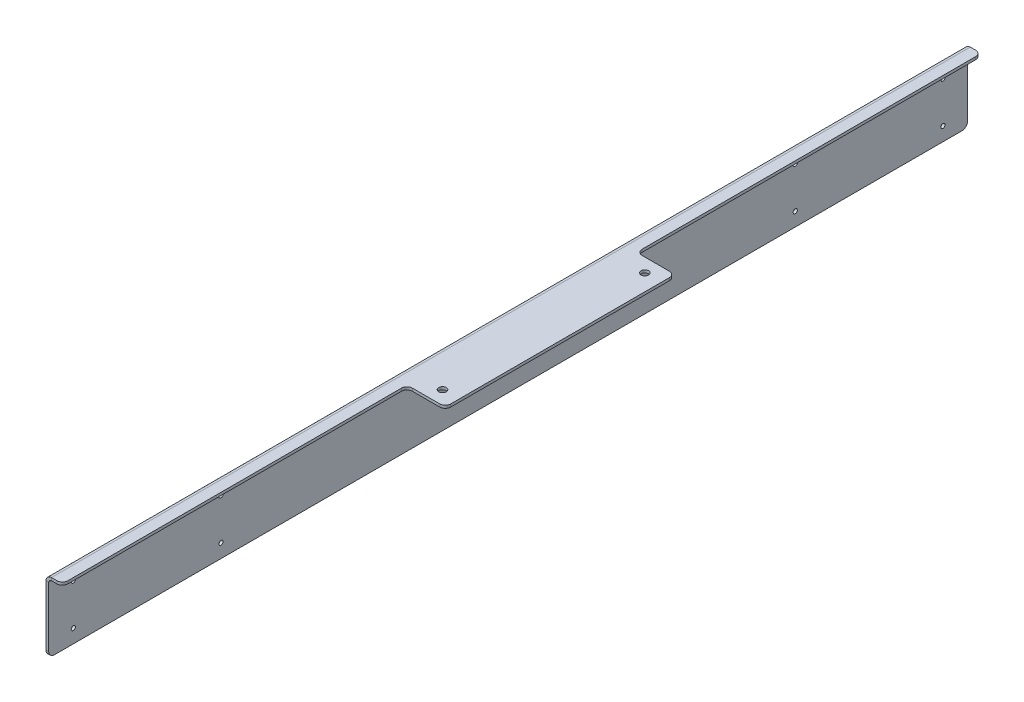
ISO-10303-21;
HEADER;
FILE_DESCRIPTION(('STEP AP214'),'2;1');
FILE_NAME('part.step','',(''),(''),'','','');
FILE_SCHEMA(('AUTOMOTIVE_DESIGN { 1 0 10303 214 1 1 1 1 }'));
ENDSEC;
DATA;
#1=APPLICATION_CONTEXT('core data for automotive mechanical design processes');
#2=APPLICATION_PROTOCOL_DEFINITION('international standard','automotive_design',2000,#1);
#3=PRODUCT_CONTEXT('',#1,'mechanical');
#4=PRODUCT('Part','Part','',(#3));
#5=PRODUCT_RELATED_PRODUCT_CATEGORY('part','',(#4));
#6=PRODUCT_DEFINITION_FORMATION('','',#4);
#7=PRODUCT_DEFINITION_CONTEXT('part definition',#1,'design');
#8=PRODUCT_DEFINITION('design','',#6,#7);
#9=PRODUCT_DEFINITION_SHAPE('','',#8);
#10=(LENGTH_UNIT() NAMED_UNIT(*) SI_UNIT(.MILLI.,.METRE.));
#11=(NAMED_UNIT(*) PLANE_ANGLE_UNIT() SI_UNIT($,.RADIAN.));
#12=(NAMED_UNIT(*) SI_UNIT($,.STERADIAN.) SOLID_ANGLE_UNIT());
#13=UNCERTAINTY_MEASURE_WITH_UNIT(LENGTH_MEASURE(1.E-05),#10,'distance_accuracy_value','');
#14=(GEOMETRIC_REPRESENTATION_CONTEXT(3) GLOBAL_UNCERTAINTY_ASSIGNED_CONTEXT((#13)) GLOBAL_UNIT_ASSIGNED_CONTEXT((#10,
#11,#12)) REPRESENTATION_CONTEXT('',''));
#15=CARTESIAN_POINT('',(0.,0.,0.));
#16=DIRECTION('',(0.,0.,1.));
#17=DIRECTION('',(1.,0.,0.));
#18=AXIS2_PLACEMENT_3D('',#15,#16,#17);
#19=CARTESIAN_POINT('',(-3.175,0.,0.));
#20=DIRECTION('',(0.,0.,1.));
#21=DIRECTION('',(1.,0.,0.));
#22=AXIS2_PLACEMENT_3D('',#19,#20,#21);
#23=PLANE('',#22);
#24=DIRECTION('',(0.,-1.,0.));
#25=VECTOR('',#24,1.);
#26=CARTESIAN_POINT('',(-3.175,0.,0.));
#27=LINE('',#26,#25);
#28=CARTESIAN_POINT('',(-3.17500000000001,76.2,0.));
#29=VERTEX_POINT('',#28);
#30=CARTESIAN_POINT('',(-3.175,6.35,0.));
#31=VERTEX_POINT('',#30);
#32=EDGE_CURVE('E273',#29,#31,#27,.T.);
#33=ORIENTED_EDGE('',*,*,#32,.T.);
#34=DIRECTION('',(1.,0.,0.));
#35=VECTOR('',#34,1.);
#36=CARTESIAN_POINT('',(-3.175,6.35,0.));
#37=LINE('',#36,#35);
#38=CARTESIAN_POINT('',(0.,6.35,0.));
#39=VERTEX_POINT('',#38);
#40=EDGE_CURVE('E297',#31,#39,#37,.T.);
#41=ORIENTED_EDGE('',*,*,#40,.T.);
#42=DIRECTION('',(0.,-1.,0.));
#43=VECTOR('',#42,1.);
#44=CARTESIAN_POINT('',(0.,0.,0.));
#45=LINE('',#44,#43);
#46=CARTESIAN_POINT('',(0.,76.2,0.));
#47=VERTEX_POINT('',#46);
#48=EDGE_CURVE('E271',#47,#39,#45,.T.);
#49=ORIENTED_EDGE('',*,*,#48,.F.);
#50=DIRECTION('',(-1.,0.,0.));
#51=VECTOR('',#50,1.);
#52=CARTESIAN_POINT('',(0.,76.2,0.));
#53=LINE('',#52,#51);
#54=EDGE_CURVE('E254',#47,#29,#53,.T.);
#55=ORIENTED_EDGE('',*,*,#54,.T.);
#56=EDGE_LOOP('',(#33,#41,#49,#55));
#57=FACE_BOUND('',#56,.T.);
#58=ADVANCED_FACE('F58',(#57),#23,.T.);
#59=CARTESIAN_POINT('',(-3.175,0.,0.));
#60=DIRECTION('',(-1.,0.,0.));
#61=DIRECTION('',(0.,0.,1.));
#62=AXIS2_PLACEMENT_3D('',#59,#60,#61);
#63=PLANE('',#62);
#64=CARTESIAN_POINT('',(-3.17500000000001,63.5000000000009,-866.775));
#65=DIRECTION('',(1.,0.,0.));
#66=DIRECTION('',(0.,0.,1.));
#67=AXIS2_PLACEMENT_3D('',#64,#65,#66);
#68=CIRCLE('',#67,2.45745000000001);
#69=CARTESIAN_POINT('',(-3.17500000000001,63.5000000000009,-864.31755));
#70=VERTEX_POINT('',#69);
#71=EDGE_CURVE('E412',#70,#70,#68,.T.);
#72=ORIENTED_EDGE('',*,*,#71,.T.);
#73=EDGE_LOOP('',(#72));
#74=FACE_BOUND('',#73,.T.);
#75=CARTESIAN_POINT('',(-3.17500000000001,15.875,-200.025));
#76=DIRECTION('',(1.,0.,0.));
#77=DIRECTION('',(0.,0.,-1.));
#78=AXIS2_PLACEMENT_3D('',#75,#76,#77);
#79=CIRCLE('',#78,2.45744999999999);
#80=CARTESIAN_POINT('',(-3.17500000000001,15.875,-202.48245));
#81=VERTEX_POINT('',#80);
#82=EDGE_CURVE('E405',#81,#81,#79,.T.);
#83=ORIENTED_EDGE('',*,*,#82,.T.);
#84=EDGE_LOOP('',(#83));
#85=FACE_BOUND('',#84,.T.);
#86=CARTESIAN_POINT('',(-3.17500000000001,15.875,-28.575));
#87=DIRECTION('',(1.,0.,0.));
#88=DIRECTION('',(0.,0.,-1.));
#89=AXIS2_PLACEMENT_3D('',#86,#87,#88);
#90=CIRCLE('',#89,2.45745);
#91=CARTESIAN_POINT('',(-3.17500000000001,15.875,-31.03245));
#92=VERTEX_POINT('',#91);
#93=EDGE_CURVE('E424',#92,#92,#90,.T.);
#94=ORIENTED_EDGE('',*,*,#93,.T.);
#95=EDGE_LOOP('',(#94));
#96=FACE_BOUND('',#95,.T.);
#97=CARTESIAN_POINT('',(-3.17500000000001,63.5,-200.025));
#98=DIRECTION('',(1.,0.,0.));
#99=DIRECTION('',(0.,0.,-1.));
#100=AXIS2_PLACEMENT_3D('',#97,#98,#99);
#101=CIRCLE('',#100,2.45745000000002);
#102=CARTESIAN_POINT('',(-3.17500000000001,63.5,-202.48245));
#103=VERTEX_POINT('',#102);
#104=EDGE_CURVE('E417',#103,#103,#101,.T.);
#105=ORIENTED_EDGE('',*,*,#104,.T.);
#106=EDGE_LOOP('',(#105));
#107=FACE_BOUND('',#106,.T.);
#108=CARTESIAN_POINT('',(-3.17500000000001,15.8750000000009,-866.775));
#109=DIRECTION('',(1.,0.,0.));
#110=DIRECTION('',(0.,0.,1.));
#111=AXIS2_PLACEMENT_3D('',#108,#109,#110);
#112=CIRCLE('',#111,2.45745000000001);
#113=CARTESIAN_POINT('',(-3.17500000000001,15.8750000000009,-864.31755));
#114=VERTEX_POINT('',#113);
#115=EDGE_CURVE('E387',#114,#114,#112,.T.);
#116=ORIENTED_EDGE('',*,*,#115,.T.);
#117=EDGE_LOOP('',(#116));
#118=FACE_BOUND('',#117,.T.);
#119=CARTESIAN_POINT('',(-3.17500000000001,15.8750000000014,-1038.225));
#120=DIRECTION('',(1.,0.,0.));
#121=DIRECTION('',(0.,0.,1.));
#122=AXIS2_PLACEMENT_3D('',#119,#120,#121);
#123=CIRCLE('',#122,2.45745000000012);
#124=CARTESIAN_POINT('',(-3.17500000000001,15.8750000000014,-1035.76755));
#125=VERTEX_POINT('',#124);
#126=EDGE_CURVE('E394',#125,#125,#123,.T.);
#127=ORIENTED_EDGE('',*,*,#126,.T.);
#128=EDGE_LOOP('',(#127));
#129=FACE_BOUND('',#128,.T.);
#130=CARTESIAN_POINT('',(-3.17500000000001,63.5000000000014,-1038.225));
#131=DIRECTION('',(1.,0.,0.));
#132=DIRECTION('',(0.,0.,1.));
#133=AXIS2_PLACEMENT_3D('',#130,#131,#132);
#134=CIRCLE('',#133,2.45745000000011);
#135=CARTESIAN_POINT('',(-3.17500000000001,63.5000000000014,-1035.76755));
#136=VERTEX_POINT('',#135);
#137=EDGE_CURVE('E400',#136,#136,#134,.T.);
#138=ORIENTED_EDGE('',*,*,#137,.T.);
#139=EDGE_LOOP('',(#138));
#140=FACE_BOUND('',#139,.T.);
#141=CARTESIAN_POINT('',(-3.17500000000001,63.5,-28.575));
#142=DIRECTION('',(1.,0.,0.));
#143=DIRECTION('',(0.,0.,-1.));
#144=AXIS2_PLACEMENT_3D('',#141,#142,#143);
#145=CIRCLE('',#144,2.45745);
#146=CARTESIAN_POINT('',(-3.17500000000001,63.5,-31.03245));
#147=VERTEX_POINT('',#146);
#148=EDGE_CURVE('E251',#147,#147,#145,.T.);
#149=ORIENTED_EDGE('',*,*,#148,.T.);
#150=EDGE_LOOP('',(#149));
#151=FACE_BOUND('',#150,.T.);
#152=DIRECTION('',(0.,1.,0.));
#153=VECTOR('',#152,1.);
#154=CARTESIAN_POINT('',(-3.175,0.,-1066.8));
#155=LINE('',#154,#153);
#156=CARTESIAN_POINT('',(-3.175,6.35000000000002,-1066.8));
#157=VERTEX_POINT('',#156);
#158=CARTESIAN_POINT('',(-3.175,76.2,-1066.8));
#159=VERTEX_POINT('',#158);
#160=EDGE_CURVE('E270',#157,#159,#155,.T.);
#161=ORIENTED_EDGE('',*,*,#160,.F.);
#162=CARTESIAN_POINT('',(-3.175,6.35,-1060.45));
#163=DIRECTION('',(-1.,0.,0.));
#164=DIRECTION('',(0.,0.,1.));
#165=AXIS2_PLACEMENT_3D('',#162,#163,#164);
#166=CIRCLE('',#165,6.35);
#167=CARTESIAN_POINT('',(-3.175,0.,-1060.45));
#168=VERTEX_POINT('',#167);
#169=EDGE_CURVE('E295',#157,#168,#166,.T.);
#170=ORIENTED_EDGE('',*,*,#169,.T.);
#171=DIRECTION('',(0.,0.,-1.));
#172=VECTOR('',#171,1.);
#173=CARTESIAN_POINT('',(-3.175,0.,-1066.8));
#174=LINE('',#173,#172);
#175=CARTESIAN_POINT('',(-3.175,0.,-6.35000000000008));
#176=VERTEX_POINT('',#175);
#177=EDGE_CURVE('E267',#176,#168,#174,.T.);
#178=ORIENTED_EDGE('',*,*,#177,.F.);
#179=CARTESIAN_POINT('',(-3.175,6.35,-6.35));
#180=DIRECTION('',(-1.,0.,0.));
#181=DIRECTION('',(0.,0.,1.));
#182=AXIS2_PLACEMENT_3D('',#179,#180,#181);
#183=CIRCLE('',#182,6.35);
#184=EDGE_CURVE('E293',#176,#31,#183,.T.);
#185=ORIENTED_EDGE('',*,*,#184,.T.);
#186=ORIENTED_EDGE('',*,*,#32,.F.);
#187=DIRECTION('',(0.,0.,1.));
#188=VECTOR('',#187,1.);
#189=CARTESIAN_POINT('',(-3.17500000000001,76.2,0.));
#190=LINE('',#189,#188);
#191=EDGE_CURVE('E204',#29,#159,#190,.F.);
#192=ORIENTED_EDGE('',*,*,#191,.T.);
#193=EDGE_LOOP('',(#161,#170,#178,#185,#186,#192));
#194=FACE_BOUND('',#193,.T.);
#195=ADVANCED_FACE('F439',(#74,#85,#96,#107,#118,#129,#140,#151,#194),#63,.T.);
#196=CARTESIAN_POINT('',(0.,0.,0.));
#197=DIRECTION('',(-1.,0.,0.));
#198=DIRECTION('',(0.,0.,1.));
#199=AXIS2_PLACEMENT_3D('',#196,#197,#198);
#200=PLANE('',#199);
#201=CARTESIAN_POINT('',(0.,63.5000000000009,-866.775));
#202=DIRECTION('',(1.,0.,0.));
#203=DIRECTION('',(0.,0.,1.));
#204=AXIS2_PLACEMENT_3D('',#201,#202,#203);
#205=CIRCLE('',#204,2.45745000000001);
#206=CARTESIAN_POINT('',(0.,63.5000000000009,-864.31755));
#207=VERTEX_POINT('',#206);
#208=EDGE_CURVE('E390',#207,#207,#205,.T.);
#209=ORIENTED_EDGE('',*,*,#208,.F.);
#210=EDGE_LOOP('',(#209));
#211=FACE_BOUND('',#210,.T.);
#212=CARTESIAN_POINT('',(0.,15.875,-200.025));
#213=DIRECTION('',(1.,0.,0.));
#214=DIRECTION('',(0.,0.,-1.));
#215=AXIS2_PLACEMENT_3D('',#212,#213,#214);
#216=CIRCLE('',#215,2.45744999999999);
#217=CARTESIAN_POINT('',(0.,15.875,-202.48245));
#218=VERTEX_POINT('',#217);
#219=EDGE_CURVE('E409',#218,#218,#216,.T.);
#220=ORIENTED_EDGE('',*,*,#219,.F.);
#221=EDGE_LOOP('',(#220));
#222=FACE_BOUND('',#221,.T.);
#223=CARTESIAN_POINT('',(0.,15.875,-28.575));
#224=DIRECTION('',(1.,0.,0.));
#225=DIRECTION('',(0.,0.,-1.));
#226=AXIS2_PLACEMENT_3D('',#223,#224,#225);
#227=CIRCLE('',#226,2.45745);
#228=CARTESIAN_POINT('',(0.,15.875,-31.03245));
#229=VERTEX_POINT('',#228);
#230=EDGE_CURVE('E408',#229,#229,#227,.T.);
#231=ORIENTED_EDGE('',*,*,#230,.F.);
#232=EDGE_LOOP('',(#231));
#233=FACE_BOUND('',#232,.T.);
#234=CARTESIAN_POINT('',(0.,63.5,-200.025));
#235=DIRECTION('',(1.,0.,0.));
#236=DIRECTION('',(0.,0.,-1.));
#237=AXIS2_PLACEMENT_3D('',#234,#235,#236);
#238=CIRCLE('',#237,2.45745000000002);
#239=CARTESIAN_POINT('',(0.,63.5,-202.48245));
#240=VERTEX_POINT('',#239);
#241=EDGE_CURVE('E421',#240,#240,#238,.T.);
#242=ORIENTED_EDGE('',*,*,#241,.F.);
#243=EDGE_LOOP('',(#242));
#244=FACE_BOUND('',#243,.T.);
#245=CARTESIAN_POINT('',(0.,15.8750000000009,-866.775));
#246=DIRECTION('',(1.,0.,0.));
#247=DIRECTION('',(0.,0.,1.));
#248=AXIS2_PLACEMENT_3D('',#245,#246,#247);
#249=CIRCLE('',#248,2.45745000000001);
#250=CARTESIAN_POINT('',(0.,15.8750000000009,-864.31755));
#251=VERTEX_POINT('',#250);
#252=EDGE_CURVE('E391',#251,#251,#249,.T.);
#253=ORIENTED_EDGE('',*,*,#252,.F.);
#254=EDGE_LOOP('',(#253));
#255=FACE_BOUND('',#254,.T.);
#256=CARTESIAN_POINT('',(0.,15.8750000000014,-1038.225));
#257=DIRECTION('',(1.,0.,0.));
#258=DIRECTION('',(0.,0.,1.));
#259=AXIS2_PLACEMENT_3D('',#256,#257,#258);
#260=CIRCLE('',#259,2.45745000000012);
#261=CARTESIAN_POINT('',(0.,15.8750000000014,-1035.76755));
#262=VERTEX_POINT('',#261);
#263=EDGE_CURVE('E397',#262,#262,#260,.T.);
#264=ORIENTED_EDGE('',*,*,#263,.F.);
#265=EDGE_LOOP('',(#264));
#266=FACE_BOUND('',#265,.T.);
#267=CARTESIAN_POINT('',(0.,63.5000000000014,-1038.225));
#268=DIRECTION('',(1.,0.,0.));
#269=DIRECTION('',(0.,0.,1.));
#270=AXIS2_PLACEMENT_3D('',#267,#268,#269);
#271=CIRCLE('',#270,2.45745000000011);
#272=CARTESIAN_POINT('',(0.,63.5000000000014,-1035.76755));
#273=VERTEX_POINT('',#272);
#274=EDGE_CURVE('E380',#273,#273,#271,.T.);
#275=ORIENTED_EDGE('',*,*,#274,.F.);
#276=EDGE_LOOP('',(#275));
#277=FACE_BOUND('',#276,.T.);
#278=CARTESIAN_POINT('',(0.,63.5,-28.575));
#279=DIRECTION('',(1.,0.,0.));
#280=DIRECTION('',(0.,0.,-1.));
#281=AXIS2_PLACEMENT_3D('',#278,#279,#280);
#282=CIRCLE('',#281,2.45745);
#283=CARTESIAN_POINT('',(0.,63.5,-31.03245));
#284=VERTEX_POINT('',#283);
#285=EDGE_CURVE('E420',#284,#284,#282,.T.);
#286=ORIENTED_EDGE('',*,*,#285,.F.);
#287=EDGE_LOOP('',(#286));
#288=FACE_BOUND('',#287,.T.);
#289=DIRECTION('',(0.,0.,-1.));
#290=VECTOR('',#289,1.);
#291=CARTESIAN_POINT('',(0.,0.,-1066.8));
#292=LINE('',#291,#290);
#293=CARTESIAN_POINT('',(0.,0.,-6.35000000000008));
#294=VERTEX_POINT('',#293);
#295=CARTESIAN_POINT('',(0.,0.,-1060.45));
#296=VERTEX_POINT('',#295);
#297=EDGE_CURVE('E265',#294,#296,#292,.T.);
#298=ORIENTED_EDGE('',*,*,#297,.T.);
#299=CARTESIAN_POINT('',(0.,6.35,-1060.45));
#300=DIRECTION('',(-1.,0.,0.));
#301=DIRECTION('',(0.,0.,1.));
#302=AXIS2_PLACEMENT_3D('',#299,#300,#301);
#303=CIRCLE('',#302,6.35);
#304=CARTESIAN_POINT('',(0.,6.35000000000002,-1066.8));
#305=VERTEX_POINT('',#304);
#306=EDGE_CURVE('E289',#296,#305,#303,.F.);
#307=ORIENTED_EDGE('',*,*,#306,.T.);
#308=DIRECTION('',(0.,1.,0.));
#309=VECTOR('',#308,1.);
#310=CARTESIAN_POINT('',(0.,0.,-1066.8));
#311=LINE('',#310,#309);
#312=CARTESIAN_POINT('',(0.,76.2,-1066.8));
#313=VERTEX_POINT('',#312);
#314=EDGE_CURVE('E279',#305,#313,#311,.T.);
#315=ORIENTED_EDGE('',*,*,#314,.T.);
#316=DIRECTION('',(0.,0.,1.));
#317=VECTOR('',#316,1.);
#318=CARTESIAN_POINT('',(0.,76.2,0.));
#319=LINE('',#318,#317);
#320=EDGE_CURVE('E258',#47,#313,#319,.F.);
#321=ORIENTED_EDGE('',*,*,#320,.F.);
#322=ORIENTED_EDGE('',*,*,#48,.T.);
#323=CARTESIAN_POINT('',(0.,6.35,-6.35));
#324=DIRECTION('',(-1.,0.,0.));
#325=DIRECTION('',(0.,0.,1.));
#326=AXIS2_PLACEMENT_3D('',#323,#324,#325);
#327=CIRCLE('',#326,6.35);
#328=EDGE_CURVE('E287',#39,#294,#327,.F.);
#329=ORIENTED_EDGE('',*,*,#328,.T.);
#330=EDGE_LOOP('',(#298,#307,#315,#321,#322,#329));
#331=FACE_BOUND('',#330,.T.);
#332=ADVANCED_FACE('F435',(#211,#222,#233,#244,#255,#266,#277,#288,#331),#200,.F.);
#333=CARTESIAN_POINT('',(-3.175,0.,-1066.8));
#334=DIRECTION('',(0.,-1.,0.));
#335=DIRECTION('',(0.,0.,-1.));
#336=AXIS2_PLACEMENT_3D('',#333,#334,#335);
#337=PLANE('',#336);
#338=ORIENTED_EDGE('',*,*,#177,.T.);
#339=DIRECTION('',(1.,0.,0.));
#340=VECTOR('',#339,1.);
#341=CARTESIAN_POINT('',(-3.175,0.,-1060.45));
#342=LINE('',#341,#340);
#343=EDGE_CURVE('E284',#168,#296,#342,.T.);
#344=ORIENTED_EDGE('',*,*,#343,.T.);
#345=ORIENTED_EDGE('',*,*,#297,.F.);
#346=DIRECTION('',(1.,0.,0.));
#347=VECTOR('',#346,1.);
#348=CARTESIAN_POINT('',(-3.175,0.,-6.35000000000008));
#349=LINE('',#348,#347);
#350=EDGE_CURVE('E276',#294,#176,#349,.F.);
#351=ORIENTED_EDGE('',*,*,#350,.T.);
#352=EDGE_LOOP('',(#338,#344,#345,#351));
#353=FACE_BOUND('',#352,.T.);
#354=ADVANCED_FACE('F438',(#353),#337,.T.);
#355=CARTESIAN_POINT('',(-3.175,0.,-1066.8));
#356=DIRECTION('',(0.,0.,-1.));
#357=DIRECTION('',(0.,1.,0.));
#358=AXIS2_PLACEMENT_3D('',#355,#356,#357);
#359=PLANE('',#358);
#360=ORIENTED_EDGE('',*,*,#314,.F.);
#361=DIRECTION('',(1.,0.,0.));
#362=VECTOR('',#361,1.);
#363=CARTESIAN_POINT('',(-3.175,6.35000000000002,-1066.8));
#364=LINE('',#363,#362);
#365=EDGE_CURVE('E291',#305,#157,#364,.F.);
#366=ORIENTED_EDGE('',*,*,#365,.T.);
#367=ORIENTED_EDGE('',*,*,#160,.T.);
#368=DIRECTION('',(-1.,0.,0.));
#369=VECTOR('',#368,1.);
#370=CARTESIAN_POINT('',(0.,76.2,-1066.8));
#371=LINE('',#370,#369);
#372=EDGE_CURVE('E262',#313,#159,#371,.T.);
#373=ORIENTED_EDGE('',*,*,#372,.F.);
#374=EDGE_LOOP('',(#360,#366,#367,#373));
#375=FACE_BOUND('',#374,.T.);
#376=ADVANCED_FACE('F465',(#375),#359,.T.);
#377=CARTESIAN_POINT('',(3.17499999999999,76.2,-1066.8));
#378=DIRECTION('',(0.,0.,-1.));
#379=DIRECTION('',(-1.,0.,0.));
#380=AXIS2_PLACEMENT_3D('',#377,#378,#379);
#381=PLANE('',#380);
#382=DIRECTION('',(0.,-1.,0.));
#383=VECTOR('',#382,1.);
#384=CARTESIAN_POINT('',(3.17499999999997,82.55,-1066.8));
#385=LINE('',#384,#383);
#386=CARTESIAN_POINT('',(3.17499999999998,79.375,-1066.8));
#387=VERTEX_POINT('',#386);
#388=CARTESIAN_POINT('',(3.17499999999997,82.55,-1066.8));
#389=VERTEX_POINT('',#388);
#390=EDGE_CURVE('E248',#387,#389,#385,.F.);
#391=ORIENTED_EDGE('',*,*,#390,.F.);
#392=CARTESIAN_POINT('',(3.17499999999999,76.2,-1066.8));
#393=DIRECTION('',(0.,0.,1.));
#394=DIRECTION('',(1.,0.,0.));
#395=AXIS2_PLACEMENT_3D('',#392,#393,#394);
#396=CIRCLE('',#395,3.175);
#397=EDGE_CURVE('E207',#313,#387,#396,.F.);
#398=ORIENTED_EDGE('',*,*,#397,.F.);
#399=ORIENTED_EDGE('',*,*,#372,.T.);
#400=CARTESIAN_POINT('',(3.17499999999999,76.2,-1066.8));
#401=DIRECTION('',(0.,0.,1.));
#402=DIRECTION('',(1.,0.,0.));
#403=AXIS2_PLACEMENT_3D('',#400,#401,#402);
#404=CIRCLE('',#403,6.35);
#405=EDGE_CURVE('E253',#159,#389,#404,.F.);
#406=ORIENTED_EDGE('',*,*,#405,.T.);
#407=EDGE_LOOP('',(#391,#398,#399,#406));
#408=FACE_BOUND('',#407,.T.);
#409=ADVANCED_FACE('F471',(#408),#381,.T.);
#410=CARTESIAN_POINT('',(3.17499999999999,76.2,0.));
#411=DIRECTION('',(0.,0.,-1.));
#412=DIRECTION('',(-1.,0.,0.));
#413=AXIS2_PLACEMENT_3D('',#410,#411,#412);
#414=PLANE('',#413);
#415=CARTESIAN_POINT('',(3.17499999999999,76.2,0.));
#416=DIRECTION('',(0.,0.,1.));
#417=DIRECTION('',(1.,0.,0.));
#418=AXIS2_PLACEMENT_3D('',#415,#416,#417);
#419=CIRCLE('',#418,3.175);
#420=CARTESIAN_POINT('',(3.17499999999998,79.375,0.));
#421=VERTEX_POINT('',#420);
#422=EDGE_CURVE('E214',#421,#47,#419,.T.);
#423=ORIENTED_EDGE('',*,*,#422,.F.);
#424=DIRECTION('',(0.,-1.,0.));
#425=VECTOR('',#424,1.);
#426=CARTESIAN_POINT('',(3.17499999999997,79.375,0.));
#427=LINE('',#426,#425);
#428=CARTESIAN_POINT('',(3.17499999999996,82.55,0.));
#429=VERTEX_POINT('',#428);
#430=EDGE_CURVE('E211',#421,#429,#427,.F.);
#431=ORIENTED_EDGE('',*,*,#430,.T.);
#432=CARTESIAN_POINT('',(3.17499999999999,76.2,0.));
#433=DIRECTION('',(0.,0.,1.));
#434=DIRECTION('',(1.,0.,0.));
#435=AXIS2_PLACEMENT_3D('',#432,#433,#434);
#436=CIRCLE('',#435,6.35);
#437=EDGE_CURVE('E196',#429,#29,#436,.T.);
#438=ORIENTED_EDGE('',*,*,#437,.T.);
#439=ORIENTED_EDGE('',*,*,#54,.F.);
#440=EDGE_LOOP('',(#423,#431,#438,#439));
#441=FACE_BOUND('',#440,.T.);
#442=ADVANCED_FACE('F212',(#441),#414,.F.);
#443=CARTESIAN_POINT('',(3.17499999999999,76.2,0.));
#444=DIRECTION('',(0.,0.,1.));
#445=DIRECTION('',(0.,1.,0.));
#446=AXIS2_PLACEMENT_3D('',#443,#444,#445);
#447=CYLINDRICAL_SURFACE('',#446,6.35);
#448=ORIENTED_EDGE('',*,*,#191,.F.);
#449=ORIENTED_EDGE('',*,*,#437,.F.);
#450=DIRECTION('',(0.,0.,1.));
#451=VECTOR('',#450,1.);
#452=CARTESIAN_POINT('',(3.17499999999997,82.55,-1066.8));
#453=LINE('',#452,#451);
#454=EDGE_CURVE('E201',#429,#389,#453,.F.);
#455=ORIENTED_EDGE('',*,*,#454,.T.);
#456=ORIENTED_EDGE('',*,*,#405,.F.);
#457=EDGE_LOOP('',(#448,#449,#455,#456));
#458=FACE_BOUND('',#457,.T.);
#459=ADVANCED_FACE('F198',(#458),#447,.T.);
#460=CARTESIAN_POINT('',(3.17499999999999,76.2,0.));
#461=DIRECTION('',(0.,0.,1.));
#462=DIRECTION('',(0.,1.,0.));
#463=AXIS2_PLACEMENT_3D('',#460,#461,#462);
#464=CYLINDRICAL_SURFACE('',#463,3.175);
#465=ORIENTED_EDGE('',*,*,#320,.T.);
#466=ORIENTED_EDGE('',*,*,#397,.T.);
#467=DIRECTION('',(0.,0.,1.));
#468=VECTOR('',#467,1.);
#469=CARTESIAN_POINT('',(3.17499999999998,79.375,-1066.8));
#470=LINE('',#469,#468);
#471=EDGE_CURVE('E219',#387,#421,#470,.T.);
#472=ORIENTED_EDGE('',*,*,#471,.T.);
#473=ORIENTED_EDGE('',*,*,#422,.T.);
#474=EDGE_LOOP('',(#465,#466,#472,#473));
#475=FACE_BOUND('',#474,.T.);
#476=ADVANCED_FACE('F459',(#475),#464,.F.);
#477=CARTESIAN_POINT('',(0.,82.55,-1066.8));
#478=DIRECTION('',(0.,0.,1.));
#479=DIRECTION('',(1.,0.,0.));
#480=AXIS2_PLACEMENT_3D('',#477,#478,#479);
#481=PLANE('',#480);
#482=DIRECTION('',(-1.,0.,0.));
#483=VECTOR('',#482,1.);
#484=CARTESIAN_POINT('',(-2.95945308253334E-13,82.55,-1066.8));
#485=LINE('',#484,#483);
#486=CARTESIAN_POINT('',(9.52499999999996,82.55,-1066.8));
#487=VERTEX_POINT('',#486);
#488=EDGE_CURVE('E227',#487,#389,#485,.T.);
#489=ORIENTED_EDGE('',*,*,#488,.F.);
#490=DIRECTION('',(0.,1.,0.));
#491=VECTOR('',#490,1.);
#492=CARTESIAN_POINT('',(9.52499999999996,82.55,-1066.8));
#493=LINE('',#492,#491);
#494=CARTESIAN_POINT('',(9.52499999999997,79.375,-1066.8));
#495=VERTEX_POINT('',#494);
#496=EDGE_CURVE('E313',#487,#495,#493,.F.);
#497=ORIENTED_EDGE('',*,*,#496,.T.);
#498=DIRECTION('',(1.,0.,0.));
#499=VECTOR('',#498,1.);
#500=CARTESIAN_POINT('',(0.,79.375,-1066.8));
#501=LINE('',#500,#499);
#502=EDGE_CURVE('E228',#495,#387,#501,.F.);
#503=ORIENTED_EDGE('',*,*,#502,.T.);
#504=ORIENTED_EDGE('',*,*,#390,.T.);
#505=EDGE_LOOP('',(#489,#497,#503,#504));
#506=FACE_BOUND('',#505,.T.);
#507=ADVANCED_FACE('F751',(#506),#481,.F.);
#508=CARTESIAN_POINT('',(60.325,82.5500000000002,0.));
#509=DIRECTION('',(0.,0.,-1.));
#510=DIRECTION('',(-1.,0.,0.));
#511=AXIS2_PLACEMENT_3D('',#508,#509,#510);
#512=PLANE('',#511);
#513=DIRECTION('',(-1.,0.,0.));
#514=VECTOR('',#513,1.);
#515=CARTESIAN_POINT('',(60.325,79.3750000000002,0.));
#516=LINE('',#515,#514);
#517=CARTESIAN_POINT('',(9.52500000000003,79.375,0.));
#518=VERTEX_POINT('',#517);
#519=EDGE_CURVE('E244',#421,#518,#516,.F.);
#520=ORIENTED_EDGE('',*,*,#519,.T.);
#521=DIRECTION('',(0.,1.,0.));
#522=VECTOR('',#521,1.);
#523=CARTESIAN_POINT('',(9.52500000000001,82.55,0.));
#524=LINE('',#523,#522);
#525=CARTESIAN_POINT('',(9.52500000000001,82.55,0.));
#526=VERTEX_POINT('',#525);
#527=EDGE_CURVE('E233',#518,#526,#524,.T.);
#528=ORIENTED_EDGE('',*,*,#527,.T.);
#529=DIRECTION('',(1.,0.,0.));
#530=VECTOR('',#529,1.);
#531=CARTESIAN_POINT('',(-2.95945308253334E-13,82.55,0.));
#532=LINE('',#531,#530);
#533=EDGE_CURVE('E225',#429,#526,#532,.T.);
#534=ORIENTED_EDGE('',*,*,#533,.F.);
#535=ORIENTED_EDGE('',*,*,#430,.F.);
#536=EDGE_LOOP('',(#520,#528,#534,#535));
#537=FACE_BOUND('',#536,.T.);
#538=ADVANCED_FACE('F231',(#537),#512,.F.);
#539=CARTESIAN_POINT('',(-2.95945308253334E-13,82.55,0.));
#540=DIRECTION('',(0.,-1.,0.));
#541=DIRECTION('',(1.,0.,0.));
#542=AXIS2_PLACEMENT_3D('',#539,#540,#541);
#543=PLANE('',#542);
#544=CARTESIAN_POINT('',(41.275,82.5500000000001,-415.925));
#545=DIRECTION('',(0.,1.,0.));
#546=DIRECTION('',(-1.,0.,0.));
#547=AXIS2_PLACEMENT_3D('',#544,#545,#546);
#548=CIRCLE('',#547,4.36879999999996);
#549=CARTESIAN_POINT('',(36.9062000000001,82.5500000000001,-415.925));
#550=VERTEX_POINT('',#549);
#551=EDGE_CURVE('E867',#550,#550,#548,.T.);
#552=ORIENTED_EDGE('',*,*,#551,.F.);
#553=EDGE_LOOP('',(#552));
#554=FACE_BOUND('',#553,.T.);
#555=CARTESIAN_POINT('',(41.275,82.5500000000001,-650.875));
#556=DIRECTION('',(0.,1.,0.));
#557=DIRECTION('',(-1.,0.,0.));
#558=AXIS2_PLACEMENT_3D('',#555,#556,#557);
#559=CIRCLE('',#558,4.36880000000005);
#560=CARTESIAN_POINT('',(36.9062,82.5500000000001,-650.875));
#561=VERTEX_POINT('',#560);
#562=EDGE_CURVE('E870',#561,#561,#559,.T.);
#563=ORIENTED_EDGE('',*,*,#562,.F.);
#564=EDGE_LOOP('',(#563));
#565=FACE_BOUND('',#564,.T.);
#566=DIRECTION('',(0.,0.,1.));
#567=VECTOR('',#566,1.);
#568=CARTESIAN_POINT('',(15.875,82.5500000000001,-1066.8));
#569=LINE('',#568,#567);
#570=CARTESIAN_POINT('',(15.875,82.5500000000001,-1060.45));
#571=VERTEX_POINT('',#570);
#572=CARTESIAN_POINT('',(15.875,82.5500000000001,-673.1));
#573=VERTEX_POINT('',#572);
#574=EDGE_CURVE('E347',#571,#573,#569,.T.);
#575=ORIENTED_EDGE('',*,*,#574,.F.);
#576=CARTESIAN_POINT('',(9.52499999999996,82.55,-1060.45));
#577=DIRECTION('',(0.,-1.,0.));
#578=DIRECTION('',(1.,0.,0.));
#579=AXIS2_PLACEMENT_3D('',#576,#577,#578);
#580=CIRCLE('',#579,6.35);
#581=EDGE_CURVE('E311',#571,#487,#580,.F.);
#582=ORIENTED_EDGE('',*,*,#581,.T.);
#583=ORIENTED_EDGE('',*,*,#488,.T.);
#584=ORIENTED_EDGE('',*,*,#454,.F.);
#585=ORIENTED_EDGE('',*,*,#533,.T.);
#586=CARTESIAN_POINT('',(9.52500000000001,82.55,-6.35));
#587=DIRECTION('',(0.,-1.,0.));
#588=DIRECTION('',(1.,0.,0.));
#589=AXIS2_PLACEMENT_3D('',#586,#587,#588);
#590=CIRCLE('',#589,6.35);
#591=CARTESIAN_POINT('',(15.875,82.5500000000001,-6.35000000000013));
#592=VERTEX_POINT('',#591);
#593=EDGE_CURVE('E309',#526,#592,#590,.F.);
#594=ORIENTED_EDGE('',*,*,#593,.T.);
#595=DIRECTION('',(0.,0.,1.));
#596=VECTOR('',#595,1.);
#597=CARTESIAN_POINT('',(15.875,82.5500000000001,-400.05));
#598=LINE('',#597,#596);
#599=CARTESIAN_POINT('',(15.875,82.5500000000001,-393.7));
#600=VERTEX_POINT('',#599);
#601=EDGE_CURVE('E375',#600,#592,#598,.T.);
#602=ORIENTED_EDGE('',*,*,#601,.F.);
#603=CARTESIAN_POINT('',(22.225,82.5500000000001,-393.7));
#604=DIRECTION('',(0.,-1.,0.));
#605=DIRECTION('',(1.,0.,0.));
#606=AXIS2_PLACEMENT_3D('',#603,#604,#605);
#607=CIRCLE('',#606,6.35);
#608=CARTESIAN_POINT('',(22.225,82.5500000000001,-400.05));
#609=VERTEX_POINT('',#608);
#610=EDGE_CURVE('E342',#600,#609,#607,.T.);
#611=ORIENTED_EDGE('',*,*,#610,.T.);
#612=DIRECTION('',(-1.,0.,0.));
#613=VECTOR('',#612,1.);
#614=CARTESIAN_POINT('',(60.325,82.5500000000002,-400.05));
#615=LINE('',#614,#613);
#616=CARTESIAN_POINT('',(53.975,82.5500000000002,-400.05));
#617=VERTEX_POINT('',#616);
#618=EDGE_CURVE('E383',#617,#609,#615,.T.);
#619=ORIENTED_EDGE('',*,*,#618,.F.);
#620=CARTESIAN_POINT('',(53.975,82.5500000000002,-406.4));
#621=DIRECTION('',(0.,-1.,0.));
#622=DIRECTION('',(1.,0.,0.));
#623=AXIS2_PLACEMENT_3D('',#620,#621,#622);
#624=CIRCLE('',#623,6.35);
#625=CARTESIAN_POINT('',(60.325,82.5500000000002,-406.4));
#626=VERTEX_POINT('',#625);
#627=EDGE_CURVE('E307',#617,#626,#624,.F.);
#628=ORIENTED_EDGE('',*,*,#627,.T.);
#629=DIRECTION('',(0.,0.,-1.));
#630=VECTOR('',#629,1.);
#631=CARTESIAN_POINT('',(60.325,82.5500000000002,0.));
#632=LINE('',#631,#630);
#633=CARTESIAN_POINT('',(60.325,82.5500000000002,-660.4));
#634=VERTEX_POINT('',#633);
#635=EDGE_CURVE('E234',#626,#634,#632,.T.);
#636=ORIENTED_EDGE('',*,*,#635,.T.);
#637=CARTESIAN_POINT('',(53.975,82.5500000000002,-660.4));
#638=DIRECTION('',(0.,-1.,0.));
#639=DIRECTION('',(1.,0.,0.));
#640=AXIS2_PLACEMENT_3D('',#637,#638,#639);
#641=CIRCLE('',#640,6.35);
#642=CARTESIAN_POINT('',(53.975,82.5500000000002,-666.75));
#643=VERTEX_POINT('',#642);
#644=EDGE_CURVE('E305',#634,#643,#641,.F.);
#645=ORIENTED_EDGE('',*,*,#644,.T.);
#646=DIRECTION('',(1.,0.,0.));
#647=VECTOR('',#646,1.);
#648=CARTESIAN_POINT('',(15.875,82.5500000000001,-666.75));
#649=LINE('',#648,#647);
#650=CARTESIAN_POINT('',(22.225,82.5500000000001,-666.75));
#651=VERTEX_POINT('',#650);
#652=EDGE_CURVE('E349',#651,#643,#649,.T.);
#653=ORIENTED_EDGE('',*,*,#652,.F.);
#654=CARTESIAN_POINT('',(22.225,82.5500000000001,-673.1));
#655=DIRECTION('',(0.,-1.,0.));
#656=DIRECTION('',(1.,0.,0.));
#657=AXIS2_PLACEMENT_3D('',#654,#655,#656);
#658=CIRCLE('',#657,6.35);
#659=EDGE_CURVE('E66',#651,#573,#658,.T.);
#660=ORIENTED_EDGE('',*,*,#659,.T.);
#661=EDGE_LOOP('',(#575,#582,#583,#584,#585,#594,#602,#611,#619,#628,#636,#645,#653,#660));
#662=FACE_BOUND('',#661,.T.);
#663=ADVANCED_FACE('F224',(#554,#565,#662),#543,.F.);
#664=CARTESIAN_POINT('',(-2.84859855002507E-13,79.375,0.));
#665=DIRECTION('',(0.,-1.,0.));
#666=DIRECTION('',(1.,0.,0.));
#667=AXIS2_PLACEMENT_3D('',#664,#665,#666);
#668=PLANE('',#667);
#669=CARTESIAN_POINT('',(41.275,79.3750000000001,-415.925));
#670=DIRECTION('',(0.,1.,0.));
#671=DIRECTION('',(-1.,0.,0.));
#672=AXIS2_PLACEMENT_3D('',#669,#670,#671);
#673=CIRCLE('',#672,4.36879999999996);
#674=CARTESIAN_POINT('',(36.9062000000001,79.3750000000001,-415.925));
#675=VERTEX_POINT('',#674);
#676=EDGE_CURVE('E872',#675,#675,#673,.T.);
#677=ORIENTED_EDGE('',*,*,#676,.T.);
#678=EDGE_LOOP('',(#677));
#679=FACE_BOUND('',#678,.T.);
#680=CARTESIAN_POINT('',(41.275,79.3750000000001,-650.875));
#681=DIRECTION('',(0.,1.,0.));
#682=DIRECTION('',(-1.,0.,0.));
#683=AXIS2_PLACEMENT_3D('',#680,#681,#682);
#684=CIRCLE('',#683,4.36880000000005);
#685=CARTESIAN_POINT('',(36.9062,79.3750000000001,-650.875));
#686=VERTEX_POINT('',#685);
#687=EDGE_CURVE('E358',#686,#686,#684,.T.);
#688=ORIENTED_EDGE('',*,*,#687,.T.);
#689=EDGE_LOOP('',(#688));
#690=FACE_BOUND('',#689,.T.);
#691=ORIENTED_EDGE('',*,*,#502,.F.);
#692=CARTESIAN_POINT('',(9.52499999999997,79.375,-1060.45));
#693=DIRECTION('',(0.,-1.,0.));
#694=DIRECTION('',(1.,0.,0.));
#695=AXIS2_PLACEMENT_3D('',#692,#693,#694);
#696=CIRCLE('',#695,6.35);
#697=CARTESIAN_POINT('',(15.875,79.3750000000001,-1060.45));
#698=VERTEX_POINT('',#697);
#699=EDGE_CURVE('E320',#495,#698,#696,.T.);
#700=ORIENTED_EDGE('',*,*,#699,.T.);
#701=DIRECTION('',(0.,0.,1.));
#702=VECTOR('',#701,1.);
#703=CARTESIAN_POINT('',(15.875,79.3750000000001,-1066.8));
#704=LINE('',#703,#702);
#705=CARTESIAN_POINT('',(15.875,79.3750000000001,-673.1));
#706=VERTEX_POINT('',#705);
#707=EDGE_CURVE('E367',#698,#706,#704,.T.);
#708=ORIENTED_EDGE('',*,*,#707,.T.);
#709=CARTESIAN_POINT('',(22.225,79.3750000000001,-673.1));
#710=DIRECTION('',(0.,-1.,0.));
#711=DIRECTION('',(1.,0.,0.));
#712=AXIS2_PLACEMENT_3D('',#709,#710,#711);
#713=CIRCLE('',#712,6.35);
#714=CARTESIAN_POINT('',(22.225,79.3750000000001,-666.75));
#715=VERTEX_POINT('',#714);
#716=EDGE_CURVE('E13',#706,#715,#713,.F.);
#717=ORIENTED_EDGE('',*,*,#716,.T.);
#718=DIRECTION('',(1.,0.,0.));
#719=VECTOR('',#718,1.);
#720=CARTESIAN_POINT('',(15.875,79.3750000000001,-666.75));
#721=LINE('',#720,#719);
#722=CARTESIAN_POINT('',(53.975,79.3750000000002,-666.75));
#723=VERTEX_POINT('',#722);
#724=EDGE_CURVE('E365',#715,#723,#721,.T.);
#725=ORIENTED_EDGE('',*,*,#724,.T.);
#726=CARTESIAN_POINT('',(53.975,79.3750000000002,-660.4));
#727=DIRECTION('',(0.,-1.,0.));
#728=DIRECTION('',(1.,0.,0.));
#729=AXIS2_PLACEMENT_3D('',#726,#727,#728);
#730=CIRCLE('',#729,6.35);
#731=CARTESIAN_POINT('',(60.325,79.3750000000002,-660.4));
#732=VERTEX_POINT('',#731);
#733=EDGE_CURVE('E315',#723,#732,#730,.T.);
#734=ORIENTED_EDGE('',*,*,#733,.T.);
#735=DIRECTION('',(0.,0.,1.));
#736=VECTOR('',#735,1.);
#737=CARTESIAN_POINT('',(60.325,79.3750000000002,-1066.8));
#738=LINE('',#737,#736);
#739=CARTESIAN_POINT('',(60.325,79.3750000000002,-406.4));
#740=VERTEX_POINT('',#739);
#741=EDGE_CURVE('E238',#740,#732,#738,.F.);
#742=ORIENTED_EDGE('',*,*,#741,.F.);
#743=CARTESIAN_POINT('',(53.975,79.3750000000002,-406.4));
#744=DIRECTION('',(0.,-1.,0.));
#745=DIRECTION('',(1.,0.,0.));
#746=AXIS2_PLACEMENT_3D('',#743,#744,#745);
#747=CIRCLE('',#746,6.35);
#748=CARTESIAN_POINT('',(53.975,79.3750000000002,-400.05));
#749=VERTEX_POINT('',#748);
#750=EDGE_CURVE('E80',#740,#749,#747,.T.);
#751=ORIENTED_EDGE('',*,*,#750,.T.);
#752=DIRECTION('',(-1.,0.,0.));
#753=VECTOR('',#752,1.);
#754=CARTESIAN_POINT('',(60.325,79.3750000000002,-400.05));
#755=LINE('',#754,#753);
#756=CARTESIAN_POINT('',(22.225,79.3750000000001,-400.05));
#757=VERTEX_POINT('',#756);
#758=EDGE_CURVE('E371',#749,#757,#755,.T.);
#759=ORIENTED_EDGE('',*,*,#758,.T.);
#760=CARTESIAN_POINT('',(22.225,79.3750000000001,-393.7));
#761=DIRECTION('',(0.,-1.,0.));
#762=DIRECTION('',(1.,0.,0.));
#763=AXIS2_PLACEMENT_3D('',#760,#761,#762);
#764=CIRCLE('',#763,6.35);
#765=CARTESIAN_POINT('',(15.875,79.3750000000001,-393.7));
#766=VERTEX_POINT('',#765);
#767=EDGE_CURVE('E344',#757,#766,#764,.F.);
#768=ORIENTED_EDGE('',*,*,#767,.T.);
#769=DIRECTION('',(0.,0.,1.));
#770=VECTOR('',#769,1.);
#771=CARTESIAN_POINT('',(15.875,79.3750000000001,-400.05));
#772=LINE('',#771,#770);
#773=CARTESIAN_POINT('',(15.875,79.3750000000001,-6.35000000000013));
#774=VERTEX_POINT('',#773);
#775=EDGE_CURVE('E373',#766,#774,#772,.T.);
#776=ORIENTED_EDGE('',*,*,#775,.T.);
#777=CARTESIAN_POINT('',(9.52500000000002,79.375,-6.35));
#778=DIRECTION('',(0.,-1.,0.));
#779=DIRECTION('',(1.,0.,0.));
#780=AXIS2_PLACEMENT_3D('',#777,#778,#779);
#781=CIRCLE('',#780,6.35);
#782=EDGE_CURVE('E318',#774,#518,#781,.T.);
#783=ORIENTED_EDGE('',*,*,#782,.T.);
#784=ORIENTED_EDGE('',*,*,#519,.F.);
#785=ORIENTED_EDGE('',*,*,#471,.F.);
#786=EDGE_LOOP('',(#691,#700,#708,#717,#725,#734,#742,#751,#759,#768,#776,#783,#784,#785));
#787=FACE_BOUND('',#786,.T.);
#788=ADVANCED_FACE('F364',(#679,#690,#787),#668,.T.);
#789=CARTESIAN_POINT('',(60.325,82.5500000000002,-1066.8));
#790=DIRECTION('',(-1.,0.,0.));
#791=DIRECTION('',(0.,-1.,0.));
#792=AXIS2_PLACEMENT_3D('',#789,#790,#791);
#793=PLANE('',#792);
#794=ORIENTED_EDGE('',*,*,#635,.F.);
#795=DIRECTION('',(0.,1.,0.));
#796=VECTOR('',#795,1.);
#797=CARTESIAN_POINT('',(60.325,82.5500000000002,-406.4));
#798=LINE('',#797,#796);
#799=EDGE_CURVE('E335',#626,#740,#798,.F.);
#800=ORIENTED_EDGE('',*,*,#799,.T.);
#801=ORIENTED_EDGE('',*,*,#741,.T.);
#802=DIRECTION('',(0.,1.,0.));
#803=VECTOR('',#802,1.);
#804=CARTESIAN_POINT('',(60.325,82.5500000000002,-660.4));
#805=LINE('',#804,#803);
#806=EDGE_CURVE('E332',#732,#634,#805,.T.);
#807=ORIENTED_EDGE('',*,*,#806,.T.);
#808=EDGE_LOOP('',(#794,#800,#801,#807));
#809=FACE_BOUND('',#808,.T.);
#810=ADVANCED_FACE('F493',(#809),#793,.F.);
#811=CARTESIAN_POINT('',(-3.17500000000001,63.5,-28.575));
#812=DIRECTION('',(1.,0.,0.));
#813=DIRECTION('',(0.,0.,-1.));
#814=AXIS2_PLACEMENT_3D('',#811,#812,#813);
#815=CYLINDRICAL_SURFACE('',#814,2.45745);
#816=ORIENTED_EDGE('',*,*,#148,.F.);
#817=EDGE_LOOP('',(#816));
#818=FACE_BOUND('',#817,.T.);
#819=ORIENTED_EDGE('',*,*,#285,.T.);
#820=EDGE_LOOP('',(#819));
#821=FACE_BOUND('',#820,.T.);
#822=ADVANCED_FACE('F433',(#818,#821),#815,.F.);
#823=CARTESIAN_POINT('',(-3.17500000000001,63.5000000000014,-1038.225));
#824=DIRECTION('',(1.,0.,0.));
#825=DIRECTION('',(0.,0.,-1.));
#826=AXIS2_PLACEMENT_3D('',#823,#824,#825);
#827=CYLINDRICAL_SURFACE('',#826,2.45745000000011);
#828=ORIENTED_EDGE('',*,*,#137,.F.);
#829=EDGE_LOOP('',(#828));
#830=FACE_BOUND('',#829,.T.);
#831=ORIENTED_EDGE('',*,*,#274,.T.);
#832=EDGE_LOOP('',(#831));
#833=FACE_BOUND('',#832,.T.);
#834=ADVANCED_FACE('F691',(#830,#833),#827,.F.);
#835=CARTESIAN_POINT('',(-3.17500000000001,15.8750000000014,-1038.225));
#836=DIRECTION('',(1.,0.,0.));
#837=DIRECTION('',(0.,0.,-1.));
#838=AXIS2_PLACEMENT_3D('',#835,#836,#837);
#839=CYLINDRICAL_SURFACE('',#838,2.45745000000012);
#840=ORIENTED_EDGE('',*,*,#126,.F.);
#841=EDGE_LOOP('',(#840));
#842=FACE_BOUND('',#841,.T.);
#843=ORIENTED_EDGE('',*,*,#263,.T.);
#844=EDGE_LOOP('',(#843));
#845=FACE_BOUND('',#844,.T.);
#846=ADVANCED_FACE('F680',(#842,#845),#839,.F.);
#847=CARTESIAN_POINT('',(-3.17500000000001,15.8750000000009,-866.775));
#848=DIRECTION('',(1.,0.,0.));
#849=DIRECTION('',(0.,0.,-1.));
#850=AXIS2_PLACEMENT_3D('',#847,#848,#849);
#851=CYLINDRICAL_SURFACE('',#850,2.45745000000001);
#852=ORIENTED_EDGE('',*,*,#115,.F.);
#853=EDGE_LOOP('',(#852));
#854=FACE_BOUND('',#853,.T.);
#855=ORIENTED_EDGE('',*,*,#252,.T.);
#856=EDGE_LOOP('',(#855));
#857=FACE_BOUND('',#856,.T.);
#858=ADVANCED_FACE('F669',(#854,#857),#851,.F.);
#859=CARTESIAN_POINT('',(-3.17500000000001,63.5,-200.025));
#860=DIRECTION('',(1.,0.,0.));
#861=DIRECTION('',(0.,0.,-1.));
#862=AXIS2_PLACEMENT_3D('',#859,#860,#861);
#863=CYLINDRICAL_SURFACE('',#862,2.45745000000002);
#864=ORIENTED_EDGE('',*,*,#104,.F.);
#865=EDGE_LOOP('',(#864));
#866=FACE_BOUND('',#865,.T.);
#867=ORIENTED_EDGE('',*,*,#241,.T.);
#868=EDGE_LOOP('',(#867));
#869=FACE_BOUND('',#868,.T.);
#870=ADVANCED_FACE('F658',(#866,#869),#863,.F.);
#871=CARTESIAN_POINT('',(-3.17500000000001,15.875,-28.575));
#872=DIRECTION('',(1.,0.,0.));
#873=DIRECTION('',(0.,0.,-1.));
#874=AXIS2_PLACEMENT_3D('',#871,#872,#873);
#875=CYLINDRICAL_SURFACE('',#874,2.45745);
#876=ORIENTED_EDGE('',*,*,#93,.F.);
#877=EDGE_LOOP('',(#876));
#878=FACE_BOUND('',#877,.T.);
#879=ORIENTED_EDGE('',*,*,#230,.T.);
#880=EDGE_LOOP('',(#879));
#881=FACE_BOUND('',#880,.T.);
#882=ADVANCED_FACE('F647',(#878,#881),#875,.F.);
#883=CARTESIAN_POINT('',(-3.17500000000001,15.875,-200.025));
#884=DIRECTION('',(1.,0.,0.));
#885=DIRECTION('',(0.,0.,-1.));
#886=AXIS2_PLACEMENT_3D('',#883,#884,#885);
#887=CYLINDRICAL_SURFACE('',#886,2.45744999999999);
#888=ORIENTED_EDGE('',*,*,#82,.F.);
#889=EDGE_LOOP('',(#888));
#890=FACE_BOUND('',#889,.T.);
#891=ORIENTED_EDGE('',*,*,#219,.T.);
#892=EDGE_LOOP('',(#891));
#893=FACE_BOUND('',#892,.T.);
#894=ADVANCED_FACE('F636',(#890,#893),#887,.F.);
#895=CARTESIAN_POINT('',(-3.17500000000001,63.5000000000009,-866.775));
#896=DIRECTION('',(1.,0.,0.));
#897=DIRECTION('',(0.,0.,-1.));
#898=AXIS2_PLACEMENT_3D('',#895,#896,#897);
#899=CYLINDRICAL_SURFACE('',#898,2.45745000000001);
#900=ORIENTED_EDGE('',*,*,#71,.F.);
#901=EDGE_LOOP('',(#900));
#902=FACE_BOUND('',#901,.T.);
#903=ORIENTED_EDGE('',*,*,#208,.T.);
#904=EDGE_LOOP('',(#903));
#905=FACE_BOUND('',#904,.T.);
#906=ADVANCED_FACE('F626',(#902,#905),#899,.F.);
#907=CARTESIAN_POINT('',(15.875,79.3750000000001,-666.75));
#908=DIRECTION('',(0.,0.,1.));
#909=DIRECTION('',(0.,-1.,0.));
#910=AXIS2_PLACEMENT_3D('',#907,#908,#909);
#911=PLANE('',#910);
#912=ORIENTED_EDGE('',*,*,#652,.T.);
#913=DIRECTION('',(0.,1.,0.));
#914=VECTOR('',#913,1.);
#915=CARTESIAN_POINT('',(53.975,79.3750000000002,-666.75));
#916=LINE('',#915,#914);
#917=EDGE_CURVE('E340',#643,#723,#916,.F.);
#918=ORIENTED_EDGE('',*,*,#917,.T.);
#919=ORIENTED_EDGE('',*,*,#724,.F.);
#920=DIRECTION('',(0.,1.,0.));
#921=VECTOR('',#920,1.);
#922=CARTESIAN_POINT('',(22.225,82.5500000000001,-666.75));
#923=LINE('',#922,#921);
#924=EDGE_CURVE('E337',#715,#651,#923,.T.);
#925=ORIENTED_EDGE('',*,*,#924,.T.);
#926=EDGE_LOOP('',(#912,#918,#919,#925));
#927=FACE_BOUND('',#926,.T.);
#928=ADVANCED_FACE('F369',(#927),#911,.F.);
#929=CARTESIAN_POINT('',(15.875,79.3750000000001,-1066.8));
#930=DIRECTION('',(-1.,0.,0.));
#931=DIRECTION('',(0.,-1.,0.));
#932=AXIS2_PLACEMENT_3D('',#929,#930,#931);
#933=PLANE('',#932);
#934=ORIENTED_EDGE('',*,*,#707,.F.);
#935=DIRECTION('',(0.,1.,0.));
#936=VECTOR('',#935,1.);
#937=CARTESIAN_POINT('',(15.875,79.3750000000001,-1060.45));
#938=LINE('',#937,#936);
#939=EDGE_CURVE('E302',#698,#571,#938,.T.);
#940=ORIENTED_EDGE('',*,*,#939,.T.);
#941=ORIENTED_EDGE('',*,*,#574,.T.);
#942=DIRECTION('',(0.,1.,0.));
#943=VECTOR('',#942,1.);
#944=CARTESIAN_POINT('',(15.875,79.3750000000001,-673.1));
#945=LINE('',#944,#943);
#946=EDGE_CURVE('E300',#573,#706,#945,.F.);
#947=ORIENTED_EDGE('',*,*,#946,.T.);
#948=EDGE_LOOP('',(#934,#940,#941,#947));
#949=FACE_BOUND('',#948,.T.);
#950=ADVANCED_FACE('F355',(#949),#933,.F.);
#951=CARTESIAN_POINT('',(15.875,79.3750000000001,-400.05));
#952=DIRECTION('',(-1.,0.,0.));
#953=DIRECTION('',(0.,-1.,0.));
#954=AXIS2_PLACEMENT_3D('',#951,#952,#953);
#955=PLANE('',#954);
#956=ORIENTED_EDGE('',*,*,#601,.T.);
#957=DIRECTION('',(0.,1.,0.));
#958=VECTOR('',#957,1.);
#959=CARTESIAN_POINT('',(15.875,79.3750000000001,-6.35000000000002));
#960=LINE('',#959,#958);
#961=EDGE_CURVE('E326',#592,#774,#960,.F.);
#962=ORIENTED_EDGE('',*,*,#961,.T.);
#963=ORIENTED_EDGE('',*,*,#775,.F.);
#964=DIRECTION('',(0.,1.,0.));
#965=VECTOR('',#964,1.);
#966=CARTESIAN_POINT('',(15.875,82.5500000000001,-393.7));
#967=LINE('',#966,#965);
#968=EDGE_CURVE('E323',#766,#600,#967,.T.);
#969=ORIENTED_EDGE('',*,*,#968,.T.);
#970=EDGE_LOOP('',(#956,#962,#963,#969));
#971=FACE_BOUND('',#970,.T.);
#972=ADVANCED_FACE('F479',(#971),#955,.F.);
#973=CARTESIAN_POINT('',(60.325,79.3750000000002,-400.05));
#974=DIRECTION('',(0.,0.,-1.));
#975=DIRECTION('',(0.,1.,0.));
#976=AXIS2_PLACEMENT_3D('',#973,#974,#975);
#977=PLANE('',#976);
#978=ORIENTED_EDGE('',*,*,#618,.T.);
#979=DIRECTION('',(0.,1.,0.));
#980=VECTOR('',#979,1.);
#981=CARTESIAN_POINT('',(22.225,79.3750000000001,-400.05));
#982=LINE('',#981,#980);
#983=EDGE_CURVE('E73',#609,#757,#982,.F.);
#984=ORIENTED_EDGE('',*,*,#983,.T.);
#985=ORIENTED_EDGE('',*,*,#758,.F.);
#986=DIRECTION('',(0.,1.,0.));
#987=VECTOR('',#986,1.);
#988=CARTESIAN_POINT('',(53.975,79.3750000000002,-400.05));
#989=LINE('',#988,#987);
#990=EDGE_CURVE('E328',#749,#617,#989,.T.);
#991=ORIENTED_EDGE('',*,*,#990,.T.);
#992=EDGE_LOOP('',(#978,#984,#985,#991));
#993=FACE_BOUND('',#992,.T.);
#994=ADVANCED_FACE('F486',(#993),#977,.F.);
#995=CARTESIAN_POINT('',(41.275,79.3750000000001,-650.875));
#996=DIRECTION('',(0.,1.,0.));
#997=DIRECTION('',(-1.,0.,0.));
#998=AXIS2_PLACEMENT_3D('',#995,#996,#997);
#999=CYLINDRICAL_SURFACE('',#998,4.36880000000005);
#1000=ORIENTED_EDGE('',*,*,#687,.F.);
#1001=EDGE_LOOP('',(#1000));
#1002=FACE_BOUND('',#1001,.T.);
#1003=ORIENTED_EDGE('',*,*,#562,.T.);
#1004=EDGE_LOOP('',(#1003));
#1005=FACE_BOUND('',#1004,.T.);
#1006=ADVANCED_FACE('F578',(#1002,#1005),#999,.F.);
#1007=CARTESIAN_POINT('',(41.275,79.3750000000001,-415.925));
#1008=DIRECTION('',(0.,1.,0.));
#1009=DIRECTION('',(-1.,0.,0.));
#1010=AXIS2_PLACEMENT_3D('',#1007,#1008,#1009);
#1011=CYLINDRICAL_SURFACE('',#1010,4.36879999999996);
#1012=ORIENTED_EDGE('',*,*,#676,.F.);
#1013=EDGE_LOOP('',(#1012));
#1014=FACE_BOUND('',#1013,.T.);
#1015=ORIENTED_EDGE('',*,*,#551,.T.);
#1016=EDGE_LOOP('',(#1015));
#1017=FACE_BOUND('',#1016,.T.);
#1018=ADVANCED_FACE('F517',(#1014,#1017),#1011,.F.);
#1019=CARTESIAN_POINT('',(-3.175,6.35,-1060.45));
#1020=DIRECTION('',(1.,0.,0.));
#1021=DIRECTION('',(0.,0.,-1.));
#1022=AXIS2_PLACEMENT_3D('',#1019,#1020,#1021);
#1023=CYLINDRICAL_SURFACE('',#1022,6.35);
#1024=ORIENTED_EDGE('',*,*,#169,.F.);
#1025=ORIENTED_EDGE('',*,*,#365,.F.);
#1026=ORIENTED_EDGE('',*,*,#306,.F.);
#1027=ORIENTED_EDGE('',*,*,#343,.F.);
#1028=EDGE_LOOP('',(#1024,#1025,#1026,#1027));
#1029=FACE_BOUND('',#1028,.T.);
#1030=ADVANCED_FACE('F468',(#1029),#1023,.T.);
#1031=CARTESIAN_POINT('',(-3.175,6.35,-6.35));
#1032=DIRECTION('',(1.,0.,0.));
#1033=DIRECTION('',(0.,0.,-1.));
#1034=AXIS2_PLACEMENT_3D('',#1031,#1032,#1033);
#1035=CYLINDRICAL_SURFACE('',#1034,6.35);
#1036=ORIENTED_EDGE('',*,*,#184,.F.);
#1037=ORIENTED_EDGE('',*,*,#350,.F.);
#1038=ORIENTED_EDGE('',*,*,#328,.F.);
#1039=ORIENTED_EDGE('',*,*,#40,.F.);
#1040=EDGE_LOOP('',(#1036,#1037,#1038,#1039));
#1041=FACE_BOUND('',#1040,.T.);
#1042=ADVANCED_FACE('F450',(#1041),#1035,.T.);
#1043=CARTESIAN_POINT('',(9.52499999999997,79.375,-1060.45));
#1044=DIRECTION('',(0.,1.,0.));
#1045=DIRECTION('',(-1.,0.,0.));
#1046=AXIS2_PLACEMENT_3D('',#1043,#1044,#1045);
#1047=CYLINDRICAL_SURFACE('',#1046,6.35);
#1048=ORIENTED_EDGE('',*,*,#699,.F.);
#1049=ORIENTED_EDGE('',*,*,#496,.F.);
#1050=ORIENTED_EDGE('',*,*,#581,.F.);
#1051=ORIENTED_EDGE('',*,*,#939,.F.);
#1052=EDGE_LOOP('',(#1048,#1049,#1050,#1051));
#1053=FACE_BOUND('',#1052,.T.);
#1054=ADVANCED_FACE('F520',(#1053),#1047,.T.);
#1055=CARTESIAN_POINT('',(9.52500000000001,82.55,-6.35));
#1056=DIRECTION('',(0.,1.,0.));
#1057=DIRECTION('',(-1.,0.,0.));
#1058=AXIS2_PLACEMENT_3D('',#1055,#1056,#1057);
#1059=CYLINDRICAL_SURFACE('',#1058,6.35);
#1060=ORIENTED_EDGE('',*,*,#782,.F.);
#1061=ORIENTED_EDGE('',*,*,#961,.F.);
#1062=ORIENTED_EDGE('',*,*,#593,.F.);
#1063=ORIENTED_EDGE('',*,*,#527,.F.);
#1064=EDGE_LOOP('',(#1060,#1061,#1062,#1063));
#1065=FACE_BOUND('',#1064,.T.);
#1066=ADVANCED_FACE('F475',(#1065),#1059,.T.);
#1067=CARTESIAN_POINT('',(22.225,79.3750000000001,-393.7));
#1068=DIRECTION('',(0.,-1.,0.));
#1069=DIRECTION('',(1.,0.,0.));
#1070=AXIS2_PLACEMENT_3D('',#1067,#1068,#1069);
#1071=CYLINDRICAL_SURFACE('',#1070,6.35);
#1072=ORIENTED_EDGE('',*,*,#767,.F.);
#1073=ORIENTED_EDGE('',*,*,#983,.F.);
#1074=ORIENTED_EDGE('',*,*,#610,.F.);
#1075=ORIENTED_EDGE('',*,*,#968,.F.);
#1076=EDGE_LOOP('',(#1072,#1073,#1074,#1075));
#1077=FACE_BOUND('',#1076,.T.);
#1078=ADVANCED_FACE('F484',(#1077),#1071,.F.);
#1079=CARTESIAN_POINT('',(53.975,79.3750000000002,-406.4));
#1080=DIRECTION('',(0.,1.,0.));
#1081=DIRECTION('',(-1.,0.,0.));
#1082=AXIS2_PLACEMENT_3D('',#1079,#1080,#1081);
#1083=CYLINDRICAL_SURFACE('',#1082,6.35);
#1084=ORIENTED_EDGE('',*,*,#750,.F.);
#1085=ORIENTED_EDGE('',*,*,#799,.F.);
#1086=ORIENTED_EDGE('',*,*,#627,.F.);
#1087=ORIENTED_EDGE('',*,*,#990,.F.);
#1088=EDGE_LOOP('',(#1084,#1085,#1086,#1087));
#1089=FACE_BOUND('',#1088,.T.);
#1090=ADVANCED_FACE('F489',(#1089),#1083,.T.);
#1091=CARTESIAN_POINT('',(53.975,82.5500000000002,-660.4));
#1092=DIRECTION('',(0.,1.,0.));
#1093=DIRECTION('',(-1.,0.,0.));
#1094=AXIS2_PLACEMENT_3D('',#1091,#1092,#1093);
#1095=CYLINDRICAL_SURFACE('',#1094,6.35);
#1096=ORIENTED_EDGE('',*,*,#733,.F.);
#1097=ORIENTED_EDGE('',*,*,#917,.F.);
#1098=ORIENTED_EDGE('',*,*,#644,.F.);
#1099=ORIENTED_EDGE('',*,*,#806,.F.);
#1100=EDGE_LOOP('',(#1096,#1097,#1098,#1099));
#1101=FACE_BOUND('',#1100,.T.);
#1102=ADVANCED_FACE('F496',(#1101),#1095,.T.);
#1103=CARTESIAN_POINT('',(22.225,79.3750000000001,-673.1));
#1104=DIRECTION('',(0.,-1.,0.));
#1105=DIRECTION('',(1.,0.,0.));
#1106=AXIS2_PLACEMENT_3D('',#1103,#1104,#1105);
#1107=CYLINDRICAL_SURFACE('',#1106,6.35);
#1108=ORIENTED_EDGE('',*,*,#716,.F.);
#1109=ORIENTED_EDGE('',*,*,#946,.F.);
#1110=ORIENTED_EDGE('',*,*,#659,.F.);
#1111=ORIENTED_EDGE('',*,*,#924,.F.);
#1112=EDGE_LOOP('',(#1108,#1109,#1110,#1111));
#1113=FACE_BOUND('',#1112,.T.);
#1114=ADVANCED_FACE('F60',(#1113),#1107,.F.);
#1115=CLOSED_SHELL('',(#58,#195,#332,#354,#376,#409,#442,#459,#476,#507,#538,#663,#788,#810,
#822,#834,#846,#858,#870,#882,#894,#906,#928,#950,#972,#994,#1006,#1018,#1030,#1042,#1054,#1066,
#1078,#1090,#1102,#1114));
#1116=MANIFOLD_SOLID_BREP('B2',#1115);
#1117=ADVANCED_BREP_SHAPE_REPRESENTATION('',(#18,#1116),#14);
#1118=SHAPE_DEFINITION_REPRESENTATION(#9,#1117);
ENDSEC;
END-ISO-10303-21;
